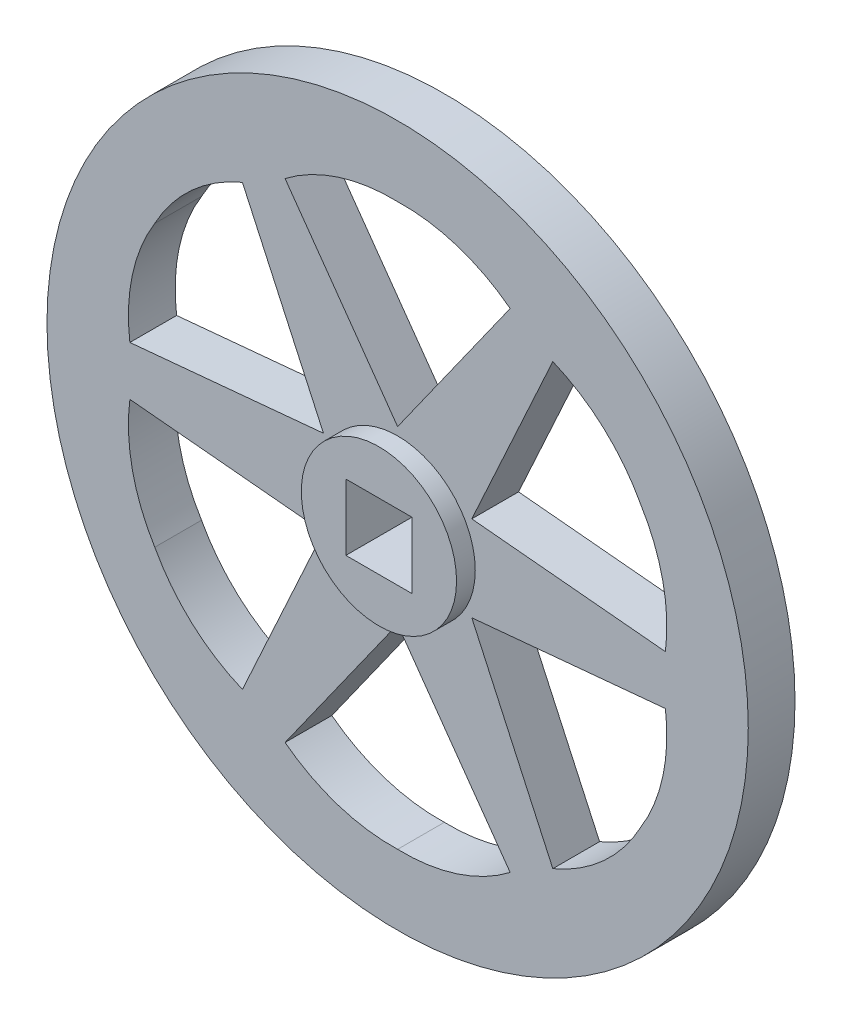
ISO-10303-21;
HEADER;
FILE_DESCRIPTION(('STEP AP214'),'2;1');
FILE_NAME('part.step','',(''),(''),'','','');
FILE_SCHEMA(('AUTOMOTIVE_DESIGN { 1 0 10303 214 1 1 1 1 }'));
ENDSEC;
DATA;
#1=APPLICATION_CONTEXT('core data for automotive mechanical design processes');
#2=APPLICATION_PROTOCOL_DEFINITION('international standard','automotive_design',2000,#1);
#3=PRODUCT_CONTEXT('',#1,'mechanical');
#4=PRODUCT('Part','Part','',(#3));
#5=PRODUCT_RELATED_PRODUCT_CATEGORY('part','',(#4));
#6=PRODUCT_DEFINITION_FORMATION('','',#4);
#7=PRODUCT_DEFINITION_CONTEXT('part definition',#1,'design');
#8=PRODUCT_DEFINITION('design','',#6,#7);
#9=PRODUCT_DEFINITION_SHAPE('','',#8);
#10=(LENGTH_UNIT() NAMED_UNIT(*) SI_UNIT(.MILLI.,.METRE.));
#11=(NAMED_UNIT(*) PLANE_ANGLE_UNIT() SI_UNIT($,.RADIAN.));
#12=(NAMED_UNIT(*) SI_UNIT($,.STERADIAN.) SOLID_ANGLE_UNIT());
#13=UNCERTAINTY_MEASURE_WITH_UNIT(LENGTH_MEASURE(1.E-05),#10,'distance_accuracy_value','');
#14=(GEOMETRIC_REPRESENTATION_CONTEXT(3) GLOBAL_UNCERTAINTY_ASSIGNED_CONTEXT((#13)) GLOBAL_UNIT_ASSIGNED_CONTEXT((#10,
#11,#12)) REPRESENTATION_CONTEXT('',''));
#15=CARTESIAN_POINT('',(0.,0.,0.));
#16=DIRECTION('',(0.,0.,1.));
#17=DIRECTION('',(1.,0.,0.));
#18=AXIS2_PLACEMENT_3D('',#15,#16,#17);
#19=CARTESIAN_POINT('',(0.,0.,2.5));
#20=DIRECTION('',(0.,0.,1.));
#21=DIRECTION('',(1.,0.,0.));
#22=AXIS2_PLACEMENT_3D('',#19,#20,#21);
#23=PLANE('',#22);
#24=CARTESIAN_POINT('',(-0.556753217472661,-11.0764587476202,2.5));
#25=DIRECTION('',(0.,0.,1.));
#26=DIRECTION('',(1.,0.,0.));
#27=AXIS2_PLACEMENT_3D('',#24,#25,#26);
#28=CIRCLE('',#27,18.919878493588);
#29=CARTESIAN_POINT('',(0.,-29.9881437086957,2.5));
#30=VERTEX_POINT('',#29);
#31=CARTESIAN_POINT('',(-12.0370715636614,-26.1152117837697,2.5));
#32=VERTEX_POINT('',#31);
#33=EDGE_CURVE('E358',#30,#32,#28,.F.);
#34=ORIENTED_EDGE('',*,*,#33,.T.);
#35=DIRECTION('',(0.578854986452261,0.815430502654489,0.));
#36=VECTOR('',#35,1.);
#37=CARTESIAN_POINT('',(4.32302539752465,-3.0688143254033,2.5));
#38=LINE('',#37,#36);
#39=CARTESIAN_POINT('',(0.,-9.15864140713367,2.5));
#40=VERTEX_POINT('',#39);
#41=EDGE_CURVE('E361',#32,#40,#38,.T.);
#42=ORIENTED_EDGE('',*,*,#41,.T.);
#43=DIRECTION('',(0.578854986452261,-0.815430502654489,0.));
#44=VECTOR('',#43,1.);
#45=CARTESIAN_POINT('',(-4.32302539752465,-3.0688143254033,2.5));
#46=LINE('',#45,#44);
#47=CARTESIAN_POINT('',(12.0370715636614,-26.1152117837697,2.5));
#48=VERTEX_POINT('',#47);
#49=EDGE_CURVE('E352',#40,#48,#46,.T.);
#50=ORIENTED_EDGE('',*,*,#49,.T.);
#51=CARTESIAN_POINT('',(0.556753217472661,-11.0764587476202,2.5));
#52=DIRECTION('',(0.,0.,1.));
#53=DIRECTION('',(1.,0.,0.));
#54=AXIS2_PLACEMENT_3D('',#51,#52,#53);
#55=CIRCLE('',#54,18.919878493588);
#56=EDGE_CURVE('E355',#48,#30,#55,.F.);
#57=ORIENTED_EDGE('',*,*,#56,.T.);
#58=EDGE_LOOP('',(#34,#42,#50,#57));
#59=FACE_BOUND('',#58,.T.);
#60=CARTESIAN_POINT('',(-9.87087126814579,-5.05606694384011,2.5));
#61=DIRECTION('',(0.,0.,1.));
#62=DIRECTION('',(1.,0.,0.));
#63=AXIS2_PLACEMENT_3D('',#60,#61,#62);
#64=CIRCLE('',#63,18.919878493588);
#65=CARTESIAN_POINT('',(-25.9704942640689,-14.994071854348,2.5));
#66=VERTEX_POINT('',#65);
#67=CARTESIAN_POINT('',(-28.634972611786,-2.63319613058295,2.5));
#68=VERTEX_POINT('',#67);
#69=EDGE_CURVE('E346',#66,#68,#64,.F.);
#70=ORIENTED_EDGE('',*,*,#69,.T.);
#71=DIRECTION('',(0.995611023545633,-0.0935878720477059,0.));
#72=VECTOR('',#71,1.);
#73=CARTESIAN_POINT('',(-0.496158466534514,-5.27825697816332,2.5));
#74=LINE('',#73,#72);
#75=CARTESIAN_POINT('',(-7.9316161227298,-4.57932070356687,2.5));
#76=VERTEX_POINT('',#75);
#77=EDGE_CURVE('E349',#68,#76,#74,.T.);
#78=ORIENTED_EDGE('',*,*,#77,.T.);
#79=DIRECTION('',(-0.416756037093367,-0.909018374702202,0.));
#80=VECTOR('',#79,1.);
#81=CARTESIAN_POINT('',(-4.8191838640592,2.20944265275999,2.5));
#82=LINE('',#81,#80);
#83=CARTESIAN_POINT('',(-16.5979010481245,-23.482015653187,2.5));
#84=VERTEX_POINT('',#83);
#85=EDGE_CURVE('E340',#76,#84,#82,.T.);
#86=ORIENTED_EDGE('',*,*,#85,.T.);
#87=CARTESIAN_POINT('',(-9.31411805067312,-6.0203918037802,2.5));
#88=DIRECTION('',(0.,0.,1.));
#89=DIRECTION('',(1.,0.,0.));
#90=AXIS2_PLACEMENT_3D('',#87,#88,#89);
#91=CIRCLE('',#90,18.919878493588);
#92=EDGE_CURVE('E343',#84,#66,#91,.F.);
#93=ORIENTED_EDGE('',*,*,#92,.T.);
#94=EDGE_LOOP('',(#70,#78,#86,#93));
#95=FACE_BOUND('',#94,.T.);
#96=CARTESIAN_POINT('',(9.3141180506732,-6.02039180378007,2.5));
#97=DIRECTION('',(0.,0.,1.));
#98=DIRECTION('',(1.,0.,0.));
#99=AXIS2_PLACEMENT_3D('',#96,#97,#98);
#100=CIRCLE('',#99,18.919878493588);
#101=CARTESIAN_POINT('',(25.9704942640691,-14.9940718543476,2.5));
#102=VERTEX_POINT('',#101);
#103=CARTESIAN_POINT('',(16.5979010481248,-23.4820156531867,2.5));
#104=VERTEX_POINT('',#103);
#105=EDGE_CURVE('E334',#102,#104,#100,.F.);
#106=ORIENTED_EDGE('',*,*,#105,.T.);
#107=DIRECTION('',(-0.41675603709338,0.909018374702196,0.));
#108=VECTOR('',#107,1.);
#109=CARTESIAN_POINT('',(4.81918386405916,2.20944265276006,2.5));
#110=LINE('',#109,#108);
#111=CARTESIAN_POINT('',(7.93161612272986,-4.57932070356676,2.5));
#112=VERTEX_POINT('',#111);
#113=EDGE_CURVE('E337',#104,#112,#110,.T.);
#114=ORIENTED_EDGE('',*,*,#113,.T.);
#115=DIRECTION('',(0.995611023545631,0.0935878720477197,0.));
#116=VECTOR('',#115,1.);
#117=CARTESIAN_POINT('',(0.496158466534587,-5.27825697816331,2.5));
#118=LINE('',#117,#116);
#119=CARTESIAN_POINT('',(28.634972611786,-2.63319613058255,2.5));
#120=VERTEX_POINT('',#119);
#121=EDGE_CURVE('E328',#112,#120,#118,.T.);
#122=ORIENTED_EDGE('',*,*,#121,.T.);
#123=CARTESIAN_POINT('',(9.87087126814585,-5.05606694383997,2.5));
#124=DIRECTION('',(0.,0.,1.));
#125=DIRECTION('',(1.,0.,0.));
#126=AXIS2_PLACEMENT_3D('',#123,#124,#125);
#127=CIRCLE('',#126,18.919878493588);
#128=EDGE_CURVE('E331',#120,#102,#127,.F.);
#129=ORIENTED_EDGE('',*,*,#128,.T.);
#130=EDGE_LOOP('',(#106,#114,#122,#129));
#131=FACE_BOUND('',#130,.T.);
#132=CARTESIAN_POINT('',(9.87087126814575,5.05606694384018,2.5));
#133=DIRECTION('',(0.,0.,1.));
#134=DIRECTION('',(1.,0.,0.));
#135=AXIS2_PLACEMENT_3D('',#132,#133,#134);
#136=CIRCLE('',#135,18.919878493588);
#137=CARTESIAN_POINT('',(25.9704942640688,14.9940718543481,2.5));
#138=VERTEX_POINT('',#137);
#139=CARTESIAN_POINT('',(28.634972611786,2.63319613058315,2.5));
#140=VERTEX_POINT('',#139);
#141=EDGE_CURVE('E322',#138,#140,#136,.F.);
#142=ORIENTED_EDGE('',*,*,#141,.T.);
#143=DIRECTION('',(-0.995611023545633,0.0935878720476988,0.));
#144=VECTOR('',#143,1.);
#145=CARTESIAN_POINT('',(0.496158466534477,5.27825697816332,2.5));
#146=LINE('',#145,#144);
#147=CARTESIAN_POINT('',(7.93161612272976,4.57932070356693,2.5));
#148=VERTEX_POINT('',#147);
#149=EDGE_CURVE('E325',#140,#148,#146,.T.);
#150=ORIENTED_EDGE('',*,*,#149,.T.);
#151=DIRECTION('',(0.416756037093361,0.909018374702204,0.));
#152=VECTOR('',#151,1.);
#153=CARTESIAN_POINT('',(4.81918386405921,-2.20944265275996,2.5));
#154=LINE('',#153,#152);
#155=CARTESIAN_POINT('',(16.5979010481243,23.4820156531871,2.5));
#156=VERTEX_POINT('',#155);
#157=EDGE_CURVE('E316',#148,#156,#154,.T.);
#158=ORIENTED_EDGE('',*,*,#157,.T.);
#159=CARTESIAN_POINT('',(9.31411805067308,6.02039180378026,2.5));
#160=DIRECTION('',(0.,0.,1.));
#161=DIRECTION('',(1.,0.,0.));
#162=AXIS2_PLACEMENT_3D('',#159,#160,#161);
#163=CIRCLE('',#162,18.919878493588);
#164=EDGE_CURVE('E319',#156,#138,#163,.F.);
#165=ORIENTED_EDGE('',*,*,#164,.T.);
#166=EDGE_LOOP('',(#142,#150,#158,#165));
#167=FACE_BOUND('',#166,.T.);
#168=CARTESIAN_POINT('',(-9.31411805067316,6.02039180378013,2.5));
#169=DIRECTION('',(0.,0.,1.));
#170=DIRECTION('',(1.,0.,0.));
#171=AXIS2_PLACEMENT_3D('',#168,#169,#170);
#172=CIRCLE('',#171,18.919878493588);
#173=CARTESIAN_POINT('',(-25.970494264069,14.9940718543478,2.5));
#174=VERTEX_POINT('',#173);
#175=CARTESIAN_POINT('',(-16.5979010481247,23.4820156531869,2.5));
#176=VERTEX_POINT('',#175);
#177=EDGE_CURVE('E310',#174,#176,#172,.F.);
#178=ORIENTED_EDGE('',*,*,#177,.T.);
#179=DIRECTION('',(0.416756037093373,-0.909018374702199,0.));
#180=VECTOR('',#179,1.);
#181=CARTESIAN_POINT('',(-4.81918386405918,-2.20944265276003,2.5));
#182=LINE('',#181,#180);
#183=CARTESIAN_POINT('',(-7.93161612272983,4.57932070356682,2.5));
#184=VERTEX_POINT('',#183);
#185=EDGE_CURVE('E313',#176,#184,#182,.T.);
#186=ORIENTED_EDGE('',*,*,#185,.T.);
#187=DIRECTION('',(-0.995611023545632,-0.0935878720477127,0.));
#188=VECTOR('',#187,1.);
#189=CARTESIAN_POINT('',(-0.49615846653455,5.27825697816331,2.5));
#190=LINE('',#189,#188);
#191=CARTESIAN_POINT('',(-28.634972611786,2.63319613058275,2.5));
#192=VERTEX_POINT('',#191);
#193=EDGE_CURVE('E304',#184,#192,#190,.T.);
#194=ORIENTED_EDGE('',*,*,#193,.T.);
#195=CARTESIAN_POINT('',(-9.87087126814582,5.05606694384004,2.5));
#196=DIRECTION('',(0.,0.,1.));
#197=DIRECTION('',(1.,0.,0.));
#198=AXIS2_PLACEMENT_3D('',#195,#196,#197);
#199=CIRCLE('',#198,18.919878493588);
#200=EDGE_CURVE('E307',#192,#174,#199,.F.);
#201=ORIENTED_EDGE('',*,*,#200,.T.);
#202=EDGE_LOOP('',(#178,#186,#194,#201));
#203=FACE_BOUND('',#202,.T.);
#204=CARTESIAN_POINT('',(0.556753217472661,11.0764587476202,2.5));
#205=DIRECTION('',(0.,0.,1.));
#206=DIRECTION('',(1.,0.,0.));
#207=AXIS2_PLACEMENT_3D('',#204,#205,#206);
#208=CIRCLE('',#207,18.919878493588);
#209=CARTESIAN_POINT('',(0.,29.9881437086957,2.5));
#210=VERTEX_POINT('',#209);
#211=CARTESIAN_POINT('',(12.0370715636614,26.1152117837697,2.5));
#212=VERTEX_POINT('',#211);
#213=EDGE_CURVE('E381',#210,#212,#208,.F.);
#214=ORIENTED_EDGE('',*,*,#213,.T.);
#215=DIRECTION('',(-0.578854986452261,-0.815430502654489,0.));
#216=VECTOR('',#215,1.);
#217=CARTESIAN_POINT('',(-4.32302539752465,3.0688143254033,2.5));
#218=LINE('',#217,#216);
#219=CARTESIAN_POINT('',(0.,9.15864140713367,2.5));
#220=VERTEX_POINT('',#219);
#221=EDGE_CURVE('E384',#212,#220,#218,.T.);
#222=ORIENTED_EDGE('',*,*,#221,.T.);
#223=DIRECTION('',(-0.578854986452261,0.815430502654489,0.));
#224=VECTOR('',#223,1.);
#225=CARTESIAN_POINT('',(4.32302539752465,3.0688143254033,2.5));
#226=LINE('',#225,#224);
#227=CARTESIAN_POINT('',(-12.0370715636614,26.1152117837697,2.5));
#228=VERTEX_POINT('',#227);
#229=EDGE_CURVE('E375',#220,#228,#226,.T.);
#230=ORIENTED_EDGE('',*,*,#229,.T.);
#231=CARTESIAN_POINT('',(-0.556753217472661,11.0764587476202,2.5));
#232=DIRECTION('',(0.,0.,1.));
#233=DIRECTION('',(1.,0.,0.));
#234=AXIS2_PLACEMENT_3D('',#231,#232,#233);
#235=CIRCLE('',#234,18.919878493588);
#236=EDGE_CURVE('E378',#228,#210,#235,.F.);
#237=ORIENTED_EDGE('',*,*,#236,.T.);
#238=EDGE_LOOP('',(#214,#222,#230,#237));
#239=FACE_BOUND('',#238,.T.);
#240=CARTESIAN_POINT('',(0.,0.,2.5));
#241=DIRECTION('',(0.,0.,1.));
#242=DIRECTION('',(1.,0.,0.));
#243=AXIS2_PLACEMENT_3D('',#240,#241,#242);
#244=CIRCLE('',#243,37.5);
#245=CARTESIAN_POINT('',(37.5,0.,2.5));
#246=VERTEX_POINT('',#245);
#247=EDGE_CURVE('E400',#246,#246,#244,.T.);
#248=ORIENTED_EDGE('',*,*,#247,.T.);
#249=EDGE_LOOP('',(#248));
#250=FACE_BOUND('',#249,.T.);
#251=CARTESIAN_POINT('',(0.,0.,2.5));
#252=DIRECTION('',(0.,0.,1.));
#253=DIRECTION('',(1.,0.,0.));
#254=AXIS2_PLACEMENT_3D('',#251,#252,#253);
#255=CIRCLE('',#254,8.30266201776204);
#256=CARTESIAN_POINT('',(8.30266201776204,0.,2.5));
#257=VERTEX_POINT('',#256);
#258=EDGE_CURVE('E247',#257,#257,#255,.T.);
#259=ORIENTED_EDGE('',*,*,#258,.F.);
#260=EDGE_LOOP('',(#259));
#261=FACE_BOUND('',#260,.T.);
#262=ADVANCED_FACE('F32',(#59,#95,#131,#167,#203,#239,#250,#261),#23,.T.);
#263=CARTESIAN_POINT('',(0.,0.,-2.5));
#264=DIRECTION('',(0.,0.,1.));
#265=DIRECTION('',(1.,0.,0.));
#266=AXIS2_PLACEMENT_3D('',#263,#264,#265);
#267=PLANE('',#266);
#268=DIRECTION('',(0.995611023545633,-0.0935878720477059,0.));
#269=VECTOR('',#268,1.);
#270=CARTESIAN_POINT('',(-0.496158466534514,-5.27825697816332,-2.5));
#271=LINE('',#270,#269);
#272=CARTESIAN_POINT('',(-28.634972611786,-2.63319613058295,-2.5));
#273=VERTEX_POINT('',#272);
#274=CARTESIAN_POINT('',(-7.9316161227298,-4.57932070356687,-2.5));
#275=VERTEX_POINT('',#274);
#276=EDGE_CURVE('E447',#273,#275,#271,.T.);
#277=ORIENTED_EDGE('',*,*,#276,.F.);
#278=CARTESIAN_POINT('',(-9.87087126814579,-5.05606694384011,-2.5));
#279=DIRECTION('',(0.,0.,1.));
#280=DIRECTION('',(1.,0.,0.));
#281=AXIS2_PLACEMENT_3D('',#278,#279,#280);
#282=CIRCLE('',#281,18.919878493588);
#283=CARTESIAN_POINT('',(-25.9704942640689,-14.994071854348,-2.5));
#284=VERTEX_POINT('',#283);
#285=EDGE_CURVE('E445',#284,#273,#282,.F.);
#286=ORIENTED_EDGE('',*,*,#285,.F.);
#287=CARTESIAN_POINT('',(-9.31411805067312,-6.0203918037802,-2.5));
#288=DIRECTION('',(0.,0.,1.));
#289=DIRECTION('',(1.,0.,0.));
#290=AXIS2_PLACEMENT_3D('',#287,#288,#289);
#291=CIRCLE('',#290,18.919878493588);
#292=CARTESIAN_POINT('',(-16.5979010481245,-23.482015653187,-2.5));
#293=VERTEX_POINT('',#292);
#294=EDGE_CURVE('E443',#293,#284,#291,.F.);
#295=ORIENTED_EDGE('',*,*,#294,.F.);
#296=DIRECTION('',(-0.416756037093367,-0.909018374702202,0.));
#297=VECTOR('',#296,1.);
#298=CARTESIAN_POINT('',(-4.8191838640592,2.20944265275999,-2.5));
#299=LINE('',#298,#297);
#300=EDGE_CURVE('E441',#275,#293,#299,.T.);
#301=ORIENTED_EDGE('',*,*,#300,.F.);
#302=EDGE_LOOP('',(#277,#286,#295,#301));
#303=FACE_BOUND('',#302,.T.);
#304=DIRECTION('',(-0.995611023545633,0.0935878720476988,0.));
#305=VECTOR('',#304,1.);
#306=CARTESIAN_POINT('',(0.496158466534477,5.27825697816332,-2.5));
#307=LINE('',#306,#305);
#308=CARTESIAN_POINT('',(28.634972611786,2.63319613058315,-2.5));
#309=VERTEX_POINT('',#308);
#310=CARTESIAN_POINT('',(7.93161612272976,4.57932070356693,-2.5));
#311=VERTEX_POINT('',#310);
#312=EDGE_CURVE('E429',#309,#311,#307,.T.);
#313=ORIENTED_EDGE('',*,*,#312,.F.);
#314=CARTESIAN_POINT('',(9.87087126814575,5.05606694384018,-2.5));
#315=DIRECTION('',(0.,0.,1.));
#316=DIRECTION('',(1.,0.,0.));
#317=AXIS2_PLACEMENT_3D('',#314,#315,#316);
#318=CIRCLE('',#317,18.919878493588);
#319=CARTESIAN_POINT('',(25.9704942640688,14.9940718543481,-2.5));
#320=VERTEX_POINT('',#319);
#321=EDGE_CURVE('E427',#320,#309,#318,.F.);
#322=ORIENTED_EDGE('',*,*,#321,.F.);
#323=CARTESIAN_POINT('',(9.31411805067308,6.02039180378026,-2.5));
#324=DIRECTION('',(0.,0.,1.));
#325=DIRECTION('',(1.,0.,0.));
#326=AXIS2_PLACEMENT_3D('',#323,#324,#325);
#327=CIRCLE('',#326,18.919878493588);
#328=CARTESIAN_POINT('',(16.5979010481243,23.4820156531871,-2.5));
#329=VERTEX_POINT('',#328);
#330=EDGE_CURVE('E425',#329,#320,#327,.F.);
#331=ORIENTED_EDGE('',*,*,#330,.F.);
#332=DIRECTION('',(0.416756037093361,0.909018374702204,0.));
#333=VECTOR('',#332,1.);
#334=CARTESIAN_POINT('',(4.81918386405921,-2.20944265275996,-2.5));
#335=LINE('',#334,#333);
#336=EDGE_CURVE('E423',#311,#329,#335,.T.);
#337=ORIENTED_EDGE('',*,*,#336,.F.);
#338=EDGE_LOOP('',(#313,#322,#331,#337));
#339=FACE_BOUND('',#338,.T.);
#340=DIRECTION('',(-0.578854986452261,-0.815430502654489,0.));
#341=VECTOR('',#340,1.);
#342=CARTESIAN_POINT('',(-4.32302539752465,3.0688143254033,-2.5));
#343=LINE('',#342,#341);
#344=CARTESIAN_POINT('',(12.0370715636614,26.1152117837697,-2.5));
#345=VERTEX_POINT('',#344);
#346=CARTESIAN_POINT('',(0.,9.15864140713367,-2.5));
#347=VERTEX_POINT('',#346);
#348=EDGE_CURVE('E411',#345,#347,#343,.T.);
#349=ORIENTED_EDGE('',*,*,#348,.F.);
#350=CARTESIAN_POINT('',(0.556753217472661,11.0764587476202,-2.5));
#351=DIRECTION('',(0.,0.,1.));
#352=DIRECTION('',(1.,0.,0.));
#353=AXIS2_PLACEMENT_3D('',#350,#351,#352);
#354=CIRCLE('',#353,18.919878493588);
#355=CARTESIAN_POINT('',(0.,29.9881437086957,-2.5));
#356=VERTEX_POINT('',#355);
#357=EDGE_CURVE('E409',#356,#345,#354,.F.);
#358=ORIENTED_EDGE('',*,*,#357,.F.);
#359=CARTESIAN_POINT('',(-0.556753217472661,11.0764587476202,-2.5));
#360=DIRECTION('',(0.,0.,1.));
#361=DIRECTION('',(1.,0.,0.));
#362=AXIS2_PLACEMENT_3D('',#359,#360,#361);
#363=CIRCLE('',#362,18.919878493588);
#364=CARTESIAN_POINT('',(-12.0370715636614,26.1152117837697,-2.5));
#365=VERTEX_POINT('',#364);
#366=EDGE_CURVE('E407',#365,#356,#363,.F.);
#367=ORIENTED_EDGE('',*,*,#366,.F.);
#368=DIRECTION('',(-0.578854986452261,0.815430502654489,0.));
#369=VECTOR('',#368,1.);
#370=CARTESIAN_POINT('',(4.32302539752465,3.0688143254033,-2.5));
#371=LINE('',#370,#369);
#372=EDGE_CURVE('E403',#347,#365,#371,.T.);
#373=ORIENTED_EDGE('',*,*,#372,.F.);
#374=EDGE_LOOP('',(#349,#358,#367,#373));
#375=FACE_BOUND('',#374,.T.);
#376=CARTESIAN_POINT('',(0.,0.,-2.5));
#377=DIRECTION('',(0.,0.,1.));
#378=DIRECTION('',(1.,0.,0.));
#379=AXIS2_PLACEMENT_3D('',#376,#377,#378);
#380=CIRCLE('',#379,37.5);
#381=CARTESIAN_POINT('',(37.5,0.,-2.5));
#382=VERTEX_POINT('',#381);
#383=EDGE_CURVE('E227',#382,#382,#380,.T.);
#384=ORIENTED_EDGE('',*,*,#383,.F.);
#385=EDGE_LOOP('',(#384));
#386=FACE_BOUND('',#385,.T.);
#387=DIRECTION('',(0.,-1.,0.));
#388=VECTOR('',#387,1.);
#389=CARTESIAN_POINT('',(-3.53553390593274,-3.53553390593274,-2.5));
#390=LINE('',#389,#388);
#391=CARTESIAN_POINT('',(-3.53553390593274,3.53553390593274,-2.5));
#392=VERTEX_POINT('',#391);
#393=CARTESIAN_POINT('',(-3.53553390593274,-3.53553390593274,-2.5));
#394=VERTEX_POINT('',#393);
#395=EDGE_CURVE('E387',#392,#394,#390,.T.);
#396=ORIENTED_EDGE('',*,*,#395,.T.);
#397=DIRECTION('',(1.,0.,0.));
#398=VECTOR('',#397,1.);
#399=CARTESIAN_POINT('',(3.53553390593274,-3.53553390593274,-2.5));
#400=LINE('',#399,#398);
#401=CARTESIAN_POINT('',(3.53553390593274,-3.53553390593274,-2.5));
#402=VERTEX_POINT('',#401);
#403=EDGE_CURVE('E224',#394,#402,#400,.T.);
#404=ORIENTED_EDGE('',*,*,#403,.T.);
#405=DIRECTION('',(0.,1.,0.));
#406=VECTOR('',#405,1.);
#407=CARTESIAN_POINT('',(3.53553390593274,-3.53553390593274,-2.5));
#408=LINE('',#407,#406);
#409=CARTESIAN_POINT('',(3.53553390593274,3.53553390593274,-2.5));
#410=VERTEX_POINT('',#409);
#411=EDGE_CURVE('E390',#402,#410,#408,.T.);
#412=ORIENTED_EDGE('',*,*,#411,.T.);
#413=DIRECTION('',(-1.,0.,0.));
#414=VECTOR('',#413,1.);
#415=CARTESIAN_POINT('',(3.53553390593274,3.53553390593274,-2.5));
#416=LINE('',#415,#414);
#417=EDGE_CURVE('E393',#410,#392,#416,.T.);
#418=ORIENTED_EDGE('',*,*,#417,.T.);
#419=EDGE_LOOP('',(#396,#404,#412,#418));
#420=FACE_BOUND('',#419,.T.);
#421=DIRECTION('',(0.416756037093373,-0.909018374702199,0.));
#422=VECTOR('',#421,1.);
#423=CARTESIAN_POINT('',(-4.81918386405918,-2.20944265276003,-2.5));
#424=LINE('',#423,#422);
#425=CARTESIAN_POINT('',(-16.5979010481247,23.4820156531869,-2.5));
#426=VERTEX_POINT('',#425);
#427=CARTESIAN_POINT('',(-7.93161612272983,4.57932070356682,-2.5));
#428=VERTEX_POINT('',#427);
#429=EDGE_CURVE('E420',#426,#428,#424,.T.);
#430=ORIENTED_EDGE('',*,*,#429,.F.);
#431=CARTESIAN_POINT('',(-9.31411805067316,6.02039180378013,-2.5));
#432=DIRECTION('',(0.,0.,1.));
#433=DIRECTION('',(1.,0.,0.));
#434=AXIS2_PLACEMENT_3D('',#431,#432,#433);
#435=CIRCLE('',#434,18.919878493588);
#436=CARTESIAN_POINT('',(-25.970494264069,14.9940718543478,-2.5));
#437=VERTEX_POINT('',#436);
#438=EDGE_CURVE('E418',#437,#426,#435,.F.);
#439=ORIENTED_EDGE('',*,*,#438,.F.);
#440=CARTESIAN_POINT('',(-9.87087126814582,5.05606694384004,-2.5));
#441=DIRECTION('',(0.,0.,1.));
#442=DIRECTION('',(1.,0.,0.));
#443=AXIS2_PLACEMENT_3D('',#440,#441,#442);
#444=CIRCLE('',#443,18.919878493588);
#445=CARTESIAN_POINT('',(-28.634972611786,2.63319613058275,-2.5));
#446=VERTEX_POINT('',#445);
#447=EDGE_CURVE('E416',#446,#437,#444,.F.);
#448=ORIENTED_EDGE('',*,*,#447,.F.);
#449=DIRECTION('',(-0.995611023545632,-0.0935878720477127,0.));
#450=VECTOR('',#449,1.);
#451=CARTESIAN_POINT('',(-0.49615846653455,5.27825697816331,-2.5));
#452=LINE('',#451,#450);
#453=EDGE_CURVE('E414',#428,#446,#452,.T.);
#454=ORIENTED_EDGE('',*,*,#453,.F.);
#455=EDGE_LOOP('',(#430,#439,#448,#454));
#456=FACE_BOUND('',#455,.T.);
#457=DIRECTION('',(-0.41675603709338,0.909018374702196,0.));
#458=VECTOR('',#457,1.);
#459=CARTESIAN_POINT('',(4.81918386405916,2.20944265276006,-2.5));
#460=LINE('',#459,#458);
#461=CARTESIAN_POINT('',(16.5979010481248,-23.4820156531867,-2.5));
#462=VERTEX_POINT('',#461);
#463=CARTESIAN_POINT('',(7.93161612272986,-4.57932070356676,-2.5));
#464=VERTEX_POINT('',#463);
#465=EDGE_CURVE('E438',#462,#464,#460,.T.);
#466=ORIENTED_EDGE('',*,*,#465,.F.);
#467=CARTESIAN_POINT('',(9.3141180506732,-6.02039180378007,-2.5));
#468=DIRECTION('',(0.,0.,1.));
#469=DIRECTION('',(1.,0.,0.));
#470=AXIS2_PLACEMENT_3D('',#467,#468,#469);
#471=CIRCLE('',#470,18.919878493588);
#472=CARTESIAN_POINT('',(25.9704942640691,-14.9940718543476,-2.5));
#473=VERTEX_POINT('',#472);
#474=EDGE_CURVE('E436',#473,#462,#471,.F.);
#475=ORIENTED_EDGE('',*,*,#474,.F.);
#476=CARTESIAN_POINT('',(9.87087126814585,-5.05606694383997,-2.5));
#477=DIRECTION('',(0.,0.,1.));
#478=DIRECTION('',(1.,0.,0.));
#479=AXIS2_PLACEMENT_3D('',#476,#477,#478);
#480=CIRCLE('',#479,18.919878493588);
#481=CARTESIAN_POINT('',(28.634972611786,-2.63319613058255,-2.5));
#482=VERTEX_POINT('',#481);
#483=EDGE_CURVE('E434',#482,#473,#480,.F.);
#484=ORIENTED_EDGE('',*,*,#483,.F.);
#485=DIRECTION('',(0.995611023545631,0.0935878720477197,0.));
#486=VECTOR('',#485,1.);
#487=CARTESIAN_POINT('',(0.496158466534587,-5.27825697816331,-2.5));
#488=LINE('',#487,#486);
#489=EDGE_CURVE('E432',#464,#482,#488,.T.);
#490=ORIENTED_EDGE('',*,*,#489,.F.);
#491=EDGE_LOOP('',(#466,#475,#484,#490));
#492=FACE_BOUND('',#491,.T.);
#493=DIRECTION('',(0.578854986452261,0.815430502654489,0.));
#494=VECTOR('',#493,1.);
#495=CARTESIAN_POINT('',(4.32302539752465,-3.0688143254033,-2.5));
#496=LINE('',#495,#494);
#497=CARTESIAN_POINT('',(-12.0370715636614,-26.1152117837697,-2.5));
#498=VERTEX_POINT('',#497);
#499=CARTESIAN_POINT('',(0.,-9.15864140713367,-2.5));
#500=VERTEX_POINT('',#499);
#501=EDGE_CURVE('E11',#498,#500,#496,.T.);
#502=ORIENTED_EDGE('',*,*,#501,.F.);
#503=CARTESIAN_POINT('',(-0.556753217472661,-11.0764587476202,-2.5));
#504=DIRECTION('',(0.,0.,1.));
#505=DIRECTION('',(1.,0.,0.));
#506=AXIS2_PLACEMENT_3D('',#503,#504,#505);
#507=CIRCLE('',#506,18.919878493588);
#508=CARTESIAN_POINT('',(0.,-29.9881437086957,-2.5));
#509=VERTEX_POINT('',#508);
#510=EDGE_CURVE('E40',#509,#498,#507,.F.);
#511=ORIENTED_EDGE('',*,*,#510,.F.);
#512=CARTESIAN_POINT('',(0.556753217472661,-11.0764587476202,-2.5));
#513=DIRECTION('',(0.,0.,1.));
#514=DIRECTION('',(1.,0.,0.));
#515=AXIS2_PLACEMENT_3D('',#512,#513,#514);
#516=CIRCLE('',#515,18.919878493588);
#517=CARTESIAN_POINT('',(12.0370715636614,-26.1152117837697,-2.5));
#518=VERTEX_POINT('',#517);
#519=EDGE_CURVE('E452',#518,#509,#516,.F.);
#520=ORIENTED_EDGE('',*,*,#519,.F.);
#521=DIRECTION('',(0.578854986452261,-0.815430502654489,0.));
#522=VECTOR('',#521,1.);
#523=CARTESIAN_POINT('',(-4.32302539752465,-3.0688143254033,-2.5));
#524=LINE('',#523,#522);
#525=EDGE_CURVE('E450',#500,#518,#524,.T.);
#526=ORIENTED_EDGE('',*,*,#525,.F.);
#527=EDGE_LOOP('',(#502,#511,#520,#526));
#528=FACE_BOUND('',#527,.T.);
#529=ADVANCED_FACE('F465',(#303,#339,#375,#386,#420,#456,#492,#528),#267,.F.);
#530=CARTESIAN_POINT('',(0.,0.,2.5));
#531=DIRECTION('',(0.,0.,-1.));
#532=DIRECTION('',(-1.,0.,0.));
#533=AXIS2_PLACEMENT_3D('',#530,#531,#532);
#534=CYLINDRICAL_SURFACE('',#533,37.5);
#535=ORIENTED_EDGE('',*,*,#247,.F.);
#536=EDGE_LOOP('',(#535));
#537=FACE_BOUND('',#536,.T.);
#538=ORIENTED_EDGE('',*,*,#383,.T.);
#539=EDGE_LOOP('',(#538));
#540=FACE_BOUND('',#539,.T.);
#541=ADVANCED_FACE('F34',(#537,#540),#534,.T.);
#542=CARTESIAN_POINT('',(-3.53553390593274,-3.53553390593274,2.5));
#543=DIRECTION('',(1.,0.,0.));
#544=DIRECTION('',(0.,0.,-1.));
#545=AXIS2_PLACEMENT_3D('',#542,#543,#544);
#546=PLANE('',#545);
#547=ORIENTED_EDGE('',*,*,#395,.F.);
#548=DIRECTION('',(0.,0.,-1.));
#549=VECTOR('',#548,1.);
#550=CARTESIAN_POINT('',(-3.53553390593274,3.53553390593274,2.5));
#551=LINE('',#550,#549);
#552=CARTESIAN_POINT('',(-3.53553390593274,3.53553390593274,4.5));
#553=VERTEX_POINT('',#552);
#554=EDGE_CURVE('E234',#553,#392,#551,.T.);
#555=ORIENTED_EDGE('',*,*,#554,.F.);
#556=DIRECTION('',(0.,-1.,0.));
#557=VECTOR('',#556,1.);
#558=CARTESIAN_POINT('',(-3.53553390593274,-3.53553390593274,4.5));
#559=LINE('',#558,#557);
#560=CARTESIAN_POINT('',(-3.53553390593274,-3.53553390593274,4.5));
#561=VERTEX_POINT('',#560);
#562=EDGE_CURVE('E231',#553,#561,#559,.T.);
#563=ORIENTED_EDGE('',*,*,#562,.T.);
#564=DIRECTION('',(0.,0.,-1.));
#565=VECTOR('',#564,1.);
#566=CARTESIAN_POINT('',(-3.53553390593274,-3.53553390593274,2.5));
#567=LINE('',#566,#565);
#568=EDGE_CURVE('E217',#561,#394,#567,.T.);
#569=ORIENTED_EDGE('',*,*,#568,.T.);
#570=EDGE_LOOP('',(#547,#555,#563,#569));
#571=FACE_BOUND('',#570,.T.);
#572=ADVANCED_FACE('F232',(#571),#546,.T.);
#573=CARTESIAN_POINT('',(3.53553390593274,-3.53553390593274,2.5));
#574=DIRECTION('',(0.,1.,0.));
#575=DIRECTION('',(-1.,0.,0.));
#576=AXIS2_PLACEMENT_3D('',#573,#574,#575);
#577=PLANE('',#576);
#578=ORIENTED_EDGE('',*,*,#403,.F.);
#579=ORIENTED_EDGE('',*,*,#568,.F.);
#580=DIRECTION('',(1.,0.,0.));
#581=VECTOR('',#580,1.);
#582=CARTESIAN_POINT('',(3.53553390593274,-3.53553390593274,4.5));
#583=LINE('',#582,#581);
#584=CARTESIAN_POINT('',(3.53553390593274,-3.53553390593274,4.5));
#585=VERTEX_POINT('',#584);
#586=EDGE_CURVE('E221',#561,#585,#583,.T.);
#587=ORIENTED_EDGE('',*,*,#586,.T.);
#588=DIRECTION('',(0.,0.,-1.));
#589=VECTOR('',#588,1.);
#590=CARTESIAN_POINT('',(3.53553390593274,-3.53553390593274,2.5));
#591=LINE('',#590,#589);
#592=EDGE_CURVE('E228',#585,#402,#591,.T.);
#593=ORIENTED_EDGE('',*,*,#592,.T.);
#594=EDGE_LOOP('',(#578,#579,#587,#593));
#595=FACE_BOUND('',#594,.T.);
#596=ADVANCED_FACE('F219',(#595),#577,.T.);
#597=CARTESIAN_POINT('',(3.53553390593274,-3.53553390593274,2.5));
#598=DIRECTION('',(-1.,0.,0.));
#599=DIRECTION('',(0.,-1.,0.));
#600=AXIS2_PLACEMENT_3D('',#597,#598,#599);
#601=PLANE('',#600);
#602=ORIENTED_EDGE('',*,*,#411,.F.);
#603=ORIENTED_EDGE('',*,*,#592,.F.);
#604=DIRECTION('',(0.,1.,0.));
#605=VECTOR('',#604,1.);
#606=CARTESIAN_POINT('',(3.53553390593274,-3.53553390593274,4.5));
#607=LINE('',#606,#605);
#608=CARTESIAN_POINT('',(3.53553390593274,3.53553390593274,4.5));
#609=VERTEX_POINT('',#608);
#610=EDGE_CURVE('E241',#585,#609,#607,.T.);
#611=ORIENTED_EDGE('',*,*,#610,.T.);
#612=DIRECTION('',(0.,0.,-1.));
#613=VECTOR('',#612,1.);
#614=CARTESIAN_POINT('',(3.53553390593274,3.53553390593274,2.5));
#615=LINE('',#614,#613);
#616=EDGE_CURVE('E397',#609,#410,#615,.T.);
#617=ORIENTED_EDGE('',*,*,#616,.T.);
#618=EDGE_LOOP('',(#602,#603,#611,#617));
#619=FACE_BOUND('',#618,.T.);
#620=ADVANCED_FACE('F583',(#619),#601,.T.);
#621=CARTESIAN_POINT('',(3.53553390593274,3.53553390593274,2.5));
#622=DIRECTION('',(0.,-1.,0.));
#623=DIRECTION('',(1.,0.,0.));
#624=AXIS2_PLACEMENT_3D('',#621,#622,#623);
#625=PLANE('',#624);
#626=ORIENTED_EDGE('',*,*,#417,.F.);
#627=ORIENTED_EDGE('',*,*,#616,.F.);
#628=DIRECTION('',(-1.,0.,0.));
#629=VECTOR('',#628,1.);
#630=CARTESIAN_POINT('',(3.53553390593274,3.53553390593274,4.5));
#631=LINE('',#630,#629);
#632=EDGE_CURVE('E243',#609,#553,#631,.T.);
#633=ORIENTED_EDGE('',*,*,#632,.T.);
#634=ORIENTED_EDGE('',*,*,#554,.T.);
#635=EDGE_LOOP('',(#626,#627,#633,#634));
#636=FACE_BOUND('',#635,.T.);
#637=ADVANCED_FACE('F579',(#636),#625,.T.);
#638=CARTESIAN_POINT('',(0.,9.15864140713367,4.));
#639=DIRECTION('',(-0.815430502654489,0.578854986452261,0.));
#640=DIRECTION('',(-0.578854986452261,-0.815430502654489,0.));
#641=AXIS2_PLACEMENT_3D('',#638,#639,#640);
#642=PLANE('',#641);
#643=DIRECTION('',(0.,0.,-1.));
#644=VECTOR('',#643,1.);
#645=CARTESIAN_POINT('',(12.0370715636614,26.1152117837697,4.));
#646=LINE('',#645,#644);
#647=EDGE_CURVE('E372',#212,#345,#646,.T.);
#648=ORIENTED_EDGE('',*,*,#647,.T.);
#649=ORIENTED_EDGE('',*,*,#348,.T.);
#650=DIRECTION('',(0.,0.,-1.));
#651=VECTOR('',#650,1.);
#652=CARTESIAN_POINT('',(0.,9.15864140713367,4.));
#653=LINE('',#652,#651);
#654=EDGE_CURVE('E364',#220,#347,#653,.T.);
#655=ORIENTED_EDGE('',*,*,#654,.F.);
#656=ORIENTED_EDGE('',*,*,#221,.F.);
#657=EDGE_LOOP('',(#648,#649,#655,#656));
#658=FACE_BOUND('',#657,.T.);
#659=ADVANCED_FACE('F575',(#658),#642,.T.);
#660=CARTESIAN_POINT('',(0.556753217472661,11.0764587476202,4.));
#661=DIRECTION('',(0.,0.,-1.));
#662=DIRECTION('',(-1.,0.,0.));
#663=AXIS2_PLACEMENT_3D('',#660,#661,#662);
#664=CYLINDRICAL_SURFACE('',#663,18.919878493588);
#665=DIRECTION('',(0.,0.,-1.));
#666=VECTOR('',#665,1.);
#667=CARTESIAN_POINT('',(0.,29.9881437086957,4.));
#668=LINE('',#667,#666);
#669=EDGE_CURVE('E369',#210,#356,#668,.T.);
#670=ORIENTED_EDGE('',*,*,#669,.T.);
#671=ORIENTED_EDGE('',*,*,#357,.T.);
#672=ORIENTED_EDGE('',*,*,#647,.F.);
#673=ORIENTED_EDGE('',*,*,#213,.F.);
#674=EDGE_LOOP('',(#670,#671,#672,#673));
#675=FACE_BOUND('',#674,.T.);
#676=ADVANCED_FACE('F571',(#675),#664,.F.);
#677=CARTESIAN_POINT('',(-0.556753217472661,11.0764587476202,4.));
#678=DIRECTION('',(0.,0.,-1.));
#679=DIRECTION('',(-1.,0.,0.));
#680=AXIS2_PLACEMENT_3D('',#677,#678,#679);
#681=CYLINDRICAL_SURFACE('',#680,18.919878493588);
#682=DIRECTION('',(0.,0.,-1.));
#683=VECTOR('',#682,1.);
#684=CARTESIAN_POINT('',(-12.0370715636614,26.1152117837697,4.));
#685=LINE('',#684,#683);
#686=EDGE_CURVE('E366',#228,#365,#685,.T.);
#687=ORIENTED_EDGE('',*,*,#686,.T.);
#688=ORIENTED_EDGE('',*,*,#366,.T.);
#689=ORIENTED_EDGE('',*,*,#669,.F.);
#690=ORIENTED_EDGE('',*,*,#236,.F.);
#691=EDGE_LOOP('',(#687,#688,#689,#690));
#692=FACE_BOUND('',#691,.T.);
#693=ADVANCED_FACE('F567',(#692),#681,.F.);
#694=CARTESIAN_POINT('',(0.,9.15864140713367,4.));
#695=DIRECTION('',(0.815430502654489,0.578854986452261,0.));
#696=DIRECTION('',(-0.578854986452261,0.815430502654489,0.));
#697=AXIS2_PLACEMENT_3D('',#694,#695,#696);
#698=PLANE('',#697);
#699=ORIENTED_EDGE('',*,*,#654,.T.);
#700=ORIENTED_EDGE('',*,*,#372,.T.);
#701=ORIENTED_EDGE('',*,*,#686,.F.);
#702=ORIENTED_EDGE('',*,*,#229,.F.);
#703=EDGE_LOOP('',(#699,#700,#701,#702));
#704=FACE_BOUND('',#703,.T.);
#705=ADVANCED_FACE('F563',(#704),#698,.T.);
#706=CARTESIAN_POINT('',(-7.93161612272983,4.57932070356682,4.));
#707=DIRECTION('',(-0.909018374702199,-0.416756037093373,0.));
#708=DIRECTION('',(0.416756037093373,-0.909018374702199,0.));
#709=AXIS2_PLACEMENT_3D('',#706,#707,#708);
#710=PLANE('',#709);
#711=DIRECTION('',(0.,0.,-1.));
#712=VECTOR('',#711,1.);
#713=CARTESIAN_POINT('',(-16.5979010481247,23.4820156531869,4.));
#714=LINE('',#713,#712);
#715=EDGE_CURVE('E301',#176,#426,#714,.T.);
#716=ORIENTED_EDGE('',*,*,#715,.T.);
#717=ORIENTED_EDGE('',*,*,#429,.T.);
#718=DIRECTION('',(0.,0.,-1.));
#719=VECTOR('',#718,1.);
#720=CARTESIAN_POINT('',(-7.93161612272983,4.57932070356682,4.));
#721=LINE('',#720,#719);
#722=EDGE_CURVE('E293',#184,#428,#721,.T.);
#723=ORIENTED_EDGE('',*,*,#722,.F.);
#724=ORIENTED_EDGE('',*,*,#185,.F.);
#725=EDGE_LOOP('',(#716,#717,#723,#724));
#726=FACE_BOUND('',#725,.T.);
#727=ADVANCED_FACE('F559',(#726),#710,.T.);
#728=CARTESIAN_POINT('',(-9.31411805067316,6.02039180378013,4.));
#729=DIRECTION('',(0.,0.,-1.));
#730=DIRECTION('',(-1.,0.,0.));
#731=AXIS2_PLACEMENT_3D('',#728,#729,#730);
#732=CYLINDRICAL_SURFACE('',#731,18.919878493588);
#733=DIRECTION('',(0.,0.,-1.));
#734=VECTOR('',#733,1.);
#735=CARTESIAN_POINT('',(-25.970494264069,14.9940718543478,4.));
#736=LINE('',#735,#734);
#737=EDGE_CURVE('E298',#174,#437,#736,.T.);
#738=ORIENTED_EDGE('',*,*,#737,.T.);
#739=ORIENTED_EDGE('',*,*,#438,.T.);
#740=ORIENTED_EDGE('',*,*,#715,.F.);
#741=ORIENTED_EDGE('',*,*,#177,.F.);
#742=EDGE_LOOP('',(#738,#739,#740,#741));
#743=FACE_BOUND('',#742,.T.);
#744=ADVANCED_FACE('F555',(#743),#732,.F.);
#745=CARTESIAN_POINT('',(-9.87087126814582,5.05606694384004,4.));
#746=DIRECTION('',(0.,0.,-1.));
#747=DIRECTION('',(-1.,0.,0.));
#748=AXIS2_PLACEMENT_3D('',#745,#746,#747);
#749=CYLINDRICAL_SURFACE('',#748,18.919878493588);
#750=DIRECTION('',(0.,0.,-1.));
#751=VECTOR('',#750,1.);
#752=CARTESIAN_POINT('',(-28.634972611786,2.63319613058275,4.));
#753=LINE('',#752,#751);
#754=EDGE_CURVE('E295',#192,#446,#753,.T.);
#755=ORIENTED_EDGE('',*,*,#754,.T.);
#756=ORIENTED_EDGE('',*,*,#447,.T.);
#757=ORIENTED_EDGE('',*,*,#737,.F.);
#758=ORIENTED_EDGE('',*,*,#200,.F.);
#759=EDGE_LOOP('',(#755,#756,#757,#758));
#760=FACE_BOUND('',#759,.T.);
#761=ADVANCED_FACE('F551',(#760),#749,.F.);
#762=CARTESIAN_POINT('',(-7.93161612272983,4.57932070356682,4.));
#763=DIRECTION('',(-0.0935878720477127,0.995611023545632,0.));
#764=DIRECTION('',(-0.995611023545632,-0.0935878720477127,0.));
#765=AXIS2_PLACEMENT_3D('',#762,#763,#764);
#766=PLANE('',#765);
#767=ORIENTED_EDGE('',*,*,#722,.T.);
#768=ORIENTED_EDGE('',*,*,#453,.T.);
#769=ORIENTED_EDGE('',*,*,#754,.F.);
#770=ORIENTED_EDGE('',*,*,#193,.F.);
#771=EDGE_LOOP('',(#767,#768,#769,#770));
#772=FACE_BOUND('',#771,.T.);
#773=ADVANCED_FACE('F525',(#772),#766,.T.);
#774=CARTESIAN_POINT('',(7.93161612272976,4.57932070356693,4.));
#775=DIRECTION('',(0.0935878720476988,0.995611023545633,0.));
#776=DIRECTION('',(-0.995611023545633,0.0935878720476988,0.));
#777=AXIS2_PLACEMENT_3D('',#774,#775,#776);
#778=PLANE('',#777);
#779=DIRECTION('',(0.,0.,-1.));
#780=VECTOR('',#779,1.);
#781=CARTESIAN_POINT('',(28.634972611786,2.63319613058315,4.));
#782=LINE('',#781,#780);
#783=EDGE_CURVE('E257',#140,#309,#782,.T.);
#784=ORIENTED_EDGE('',*,*,#783,.T.);
#785=ORIENTED_EDGE('',*,*,#312,.T.);
#786=DIRECTION('',(0.,0.,-1.));
#787=VECTOR('',#786,1.);
#788=CARTESIAN_POINT('',(7.93161612272976,4.57932070356693,4.));
#789=LINE('',#788,#787);
#790=EDGE_CURVE('E251',#148,#311,#789,.T.);
#791=ORIENTED_EDGE('',*,*,#790,.F.);
#792=ORIENTED_EDGE('',*,*,#149,.F.);
#793=EDGE_LOOP('',(#784,#785,#791,#792));
#794=FACE_BOUND('',#793,.T.);
#795=ADVANCED_FACE('F521',(#794),#778,.T.);
#796=CARTESIAN_POINT('',(9.87087126814575,5.05606694384018,4.));
#797=DIRECTION('',(0.,0.,-1.));
#798=DIRECTION('',(-1.,0.,0.));
#799=AXIS2_PLACEMENT_3D('',#796,#797,#798);
#800=CYLINDRICAL_SURFACE('',#799,18.919878493588);
#801=DIRECTION('',(0.,0.,-1.));
#802=VECTOR('',#801,1.);
#803=CARTESIAN_POINT('',(25.9704942640688,14.9940718543481,4.));
#804=LINE('',#803,#802);
#805=EDGE_CURVE('E271',#138,#320,#804,.T.);
#806=ORIENTED_EDGE('',*,*,#805,.T.);
#807=ORIENTED_EDGE('',*,*,#321,.T.);
#808=ORIENTED_EDGE('',*,*,#783,.F.);
#809=ORIENTED_EDGE('',*,*,#141,.F.);
#810=EDGE_LOOP('',(#806,#807,#808,#809));
#811=FACE_BOUND('',#810,.T.);
#812=ADVANCED_FACE('F517',(#811),#800,.F.);
#813=CARTESIAN_POINT('',(9.31411805067308,6.02039180378026,4.));
#814=DIRECTION('',(0.,0.,-1.));
#815=DIRECTION('',(-1.,0.,0.));
#816=AXIS2_PLACEMENT_3D('',#813,#814,#815);
#817=CYLINDRICAL_SURFACE('',#816,18.919878493588);
#818=DIRECTION('',(0.,0.,-1.));
#819=VECTOR('',#818,1.);
#820=CARTESIAN_POINT('',(16.5979010481243,23.4820156531871,4.));
#821=LINE('',#820,#819);
#822=EDGE_CURVE('E268',#156,#329,#821,.T.);
#823=ORIENTED_EDGE('',*,*,#822,.T.);
#824=ORIENTED_EDGE('',*,*,#330,.T.);
#825=ORIENTED_EDGE('',*,*,#805,.F.);
#826=ORIENTED_EDGE('',*,*,#164,.F.);
#827=EDGE_LOOP('',(#823,#824,#825,#826));
#828=FACE_BOUND('',#827,.T.);
#829=ADVANCED_FACE('F513',(#828),#817,.F.);
#830=CARTESIAN_POINT('',(7.93161612272976,4.57932070356693,4.));
#831=DIRECTION('',(0.909018374702204,-0.416756037093361,0.));
#832=DIRECTION('',(0.416756037093361,0.909018374702204,0.));
#833=AXIS2_PLACEMENT_3D('',#830,#831,#832);
#834=PLANE('',#833);
#835=ORIENTED_EDGE('',*,*,#790,.T.);
#836=ORIENTED_EDGE('',*,*,#336,.T.);
#837=ORIENTED_EDGE('',*,*,#822,.F.);
#838=ORIENTED_EDGE('',*,*,#157,.F.);
#839=EDGE_LOOP('',(#835,#836,#837,#838));
#840=FACE_BOUND('',#839,.T.);
#841=ADVANCED_FACE('F509',(#840),#834,.T.);
#842=CARTESIAN_POINT('',(7.93161612272986,-4.57932070356676,4.));
#843=DIRECTION('',(0.909018374702196,0.41675603709338,0.));
#844=DIRECTION('',(-0.41675603709338,0.909018374702196,0.));
#845=AXIS2_PLACEMENT_3D('',#842,#843,#844);
#846=PLANE('',#845);
#847=DIRECTION('',(0.,0.,-1.));
#848=VECTOR('',#847,1.);
#849=CARTESIAN_POINT('',(16.5979010481248,-23.4820156531867,4.));
#850=LINE('',#849,#848);
#851=EDGE_CURVE('E263',#104,#462,#850,.T.);
#852=ORIENTED_EDGE('',*,*,#851,.T.);
#853=ORIENTED_EDGE('',*,*,#465,.T.);
#854=DIRECTION('',(0.,0.,-1.));
#855=VECTOR('',#854,1.);
#856=CARTESIAN_POINT('',(7.93161612272986,-4.57932070356676,4.));
#857=LINE('',#856,#855);
#858=EDGE_CURVE('E254',#112,#464,#857,.T.);
#859=ORIENTED_EDGE('',*,*,#858,.F.);
#860=ORIENTED_EDGE('',*,*,#113,.F.);
#861=EDGE_LOOP('',(#852,#853,#859,#860));
#862=FACE_BOUND('',#861,.T.);
#863=ADVANCED_FACE('F505',(#862),#846,.T.);
#864=CARTESIAN_POINT('',(9.3141180506732,-6.02039180378007,4.));
#865=DIRECTION('',(0.,0.,-1.));
#866=DIRECTION('',(-1.,0.,0.));
#867=AXIS2_PLACEMENT_3D('',#864,#865,#866);
#868=CYLINDRICAL_SURFACE('',#867,18.919878493588);
#869=DIRECTION('',(0.,0.,-1.));
#870=VECTOR('',#869,1.);
#871=CARTESIAN_POINT('',(25.9704942640691,-14.9940718543476,4.));
#872=LINE('',#871,#870);
#873=EDGE_CURVE('E260',#102,#473,#872,.T.);
#874=ORIENTED_EDGE('',*,*,#873,.T.);
#875=ORIENTED_EDGE('',*,*,#474,.T.);
#876=ORIENTED_EDGE('',*,*,#851,.F.);
#877=ORIENTED_EDGE('',*,*,#105,.F.);
#878=EDGE_LOOP('',(#874,#875,#876,#877));
#879=FACE_BOUND('',#878,.T.);
#880=ADVANCED_FACE('F501',(#879),#868,.F.);
#881=CARTESIAN_POINT('',(9.87087126814585,-5.05606694383997,4.));
#882=DIRECTION('',(0.,0.,-1.));
#883=DIRECTION('',(-1.,0.,0.));
#884=AXIS2_PLACEMENT_3D('',#881,#882,#883);
#885=CYLINDRICAL_SURFACE('',#884,18.919878493588);
#886=DIRECTION('',(0.,0.,-1.));
#887=VECTOR('',#886,1.);
#888=CARTESIAN_POINT('',(28.634972611786,-2.63319613058255,4.));
#889=LINE('',#888,#887);
#890=EDGE_CURVE('E256',#120,#482,#889,.T.);
#891=ORIENTED_EDGE('',*,*,#890,.T.);
#892=ORIENTED_EDGE('',*,*,#483,.T.);
#893=ORIENTED_EDGE('',*,*,#873,.F.);
#894=ORIENTED_EDGE('',*,*,#128,.F.);
#895=EDGE_LOOP('',(#891,#892,#893,#894));
#896=FACE_BOUND('',#895,.T.);
#897=ADVANCED_FACE('F497',(#896),#885,.F.);
#898=CARTESIAN_POINT('',(7.93161612272986,-4.57932070356676,4.));
#899=DIRECTION('',(0.0935878720477197,-0.995611023545631,0.));
#900=DIRECTION('',(0.995611023545631,0.0935878720477197,0.));
#901=AXIS2_PLACEMENT_3D('',#898,#899,#900);
#902=PLANE('',#901);
#903=ORIENTED_EDGE('',*,*,#858,.T.);
#904=ORIENTED_EDGE('',*,*,#489,.T.);
#905=ORIENTED_EDGE('',*,*,#890,.F.);
#906=ORIENTED_EDGE('',*,*,#121,.F.);
#907=EDGE_LOOP('',(#903,#904,#905,#906));
#908=FACE_BOUND('',#907,.T.);
#909=ADVANCED_FACE('F493',(#908),#902,.T.);
#910=CARTESIAN_POINT('',(-7.9316161227298,-4.57932070356687,4.));
#911=DIRECTION('',(-0.0935878720477059,-0.995611023545633,0.));
#912=DIRECTION('',(0.995611023545633,-0.0935878720477059,0.));
#913=AXIS2_PLACEMENT_3D('',#910,#911,#912);
#914=PLANE('',#913);
#915=DIRECTION('',(0.,0.,-1.));
#916=VECTOR('',#915,1.);
#917=CARTESIAN_POINT('',(-28.634972611786,-2.63319613058295,4.));
#918=LINE('',#917,#916);
#919=EDGE_CURVE('E290',#68,#273,#918,.T.);
#920=ORIENTED_EDGE('',*,*,#919,.T.);
#921=ORIENTED_EDGE('',*,*,#276,.T.);
#922=DIRECTION('',(0.,0.,-1.));
#923=VECTOR('',#922,1.);
#924=CARTESIAN_POINT('',(-7.9316161227298,-4.57932070356687,4.));
#925=LINE('',#924,#923);
#926=EDGE_CURVE('E284',#76,#275,#925,.T.);
#927=ORIENTED_EDGE('',*,*,#926,.F.);
#928=ORIENTED_EDGE('',*,*,#77,.F.);
#929=EDGE_LOOP('',(#920,#921,#927,#928));
#930=FACE_BOUND('',#929,.T.);
#931=ADVANCED_FACE('F496',(#930),#914,.T.);
#932=CARTESIAN_POINT('',(-9.87087126814579,-5.05606694384011,4.));
#933=DIRECTION('',(0.,0.,-1.));
#934=DIRECTION('',(-1.,0.,0.));
#935=AXIS2_PLACEMENT_3D('',#932,#933,#934);
#936=CYLINDRICAL_SURFACE('',#935,18.919878493588);
#937=DIRECTION('',(0.,0.,-1.));
#938=VECTOR('',#937,1.);
#939=CARTESIAN_POINT('',(-25.9704942640689,-14.994071854348,4.));
#940=LINE('',#939,#938);
#941=EDGE_CURVE('E287',#66,#284,#940,.T.);
#942=ORIENTED_EDGE('',*,*,#941,.T.);
#943=ORIENTED_EDGE('',*,*,#285,.T.);
#944=ORIENTED_EDGE('',*,*,#919,.F.);
#945=ORIENTED_EDGE('',*,*,#69,.F.);
#946=EDGE_LOOP('',(#942,#943,#944,#945));
#947=FACE_BOUND('',#946,.T.);
#948=ADVANCED_FACE('F541',(#947),#936,.F.);
#949=CARTESIAN_POINT('',(-9.31411805067312,-6.0203918037802,4.));
#950=DIRECTION('',(0.,0.,-1.));
#951=DIRECTION('',(-1.,0.,0.));
#952=AXIS2_PLACEMENT_3D('',#949,#950,#951);
#953=CYLINDRICAL_SURFACE('',#952,18.919878493588);
#954=DIRECTION('',(0.,0.,-1.));
#955=VECTOR('',#954,1.);
#956=CARTESIAN_POINT('',(-16.5979010481245,-23.482015653187,4.));
#957=LINE('',#956,#955);
#958=EDGE_CURVE('E55',#84,#293,#957,.T.);
#959=ORIENTED_EDGE('',*,*,#958,.T.);
#960=ORIENTED_EDGE('',*,*,#294,.T.);
#961=ORIENTED_EDGE('',*,*,#941,.F.);
#962=ORIENTED_EDGE('',*,*,#92,.F.);
#963=EDGE_LOOP('',(#959,#960,#961,#962));
#964=FACE_BOUND('',#963,.T.);
#965=ADVANCED_FACE('F538',(#964),#953,.F.);
#966=CARTESIAN_POINT('',(-7.9316161227298,-4.57932070356687,4.));
#967=DIRECTION('',(-0.909018374702202,0.416756037093367,0.));
#968=DIRECTION('',(-0.416756037093367,-0.909018374702202,0.));
#969=AXIS2_PLACEMENT_3D('',#966,#967,#968);
#970=PLANE('',#969);
#971=ORIENTED_EDGE('',*,*,#926,.T.);
#972=ORIENTED_EDGE('',*,*,#300,.T.);
#973=ORIENTED_EDGE('',*,*,#958,.F.);
#974=ORIENTED_EDGE('',*,*,#85,.F.);
#975=EDGE_LOOP('',(#971,#972,#973,#974));
#976=FACE_BOUND('',#975,.T.);
#977=ADVANCED_FACE('F535',(#976),#970,.T.);
#978=CARTESIAN_POINT('',(0.,-9.15864140713367,4.));
#979=DIRECTION('',(0.815430502654489,-0.578854986452261,0.));
#980=DIRECTION('',(0.578854986452261,0.815430502654489,0.));
#981=AXIS2_PLACEMENT_3D('',#978,#979,#980);
#982=PLANE('',#981);
#983=DIRECTION('',(0.,0.,-1.));
#984=VECTOR('',#983,1.);
#985=CARTESIAN_POINT('',(-12.0370715636614,-26.1152117837697,4.));
#986=LINE('',#985,#984);
#987=EDGE_CURVE('E281',#32,#498,#986,.T.);
#988=ORIENTED_EDGE('',*,*,#987,.T.);
#989=ORIENTED_EDGE('',*,*,#501,.T.);
#990=DIRECTION('',(0.,0.,-1.));
#991=VECTOR('',#990,1.);
#992=CARTESIAN_POINT('',(0.,-9.15864140713367,4.));
#993=LINE('',#992,#991);
#994=EDGE_CURVE('E266',#40,#500,#993,.T.);
#995=ORIENTED_EDGE('',*,*,#994,.F.);
#996=ORIENTED_EDGE('',*,*,#41,.F.);
#997=EDGE_LOOP('',(#988,#989,#995,#996));
#998=FACE_BOUND('',#997,.T.);
#999=ADVANCED_FACE('F462',(#998),#982,.T.);
#1000=CARTESIAN_POINT('',(-0.556753217472661,-11.0764587476202,4.));
#1001=DIRECTION('',(0.,0.,-1.));
#1002=DIRECTION('',(-1.,0.,0.));
#1003=AXIS2_PLACEMENT_3D('',#1000,#1001,#1002);
#1004=CYLINDRICAL_SURFACE('',#1003,18.919878493588);
#1005=DIRECTION('',(0.,0.,-1.));
#1006=VECTOR('',#1005,1.);
#1007=CARTESIAN_POINT('',(0.,-29.9881437086957,4.));
#1008=LINE('',#1007,#1006);
#1009=EDGE_CURVE('E278',#30,#509,#1008,.T.);
#1010=ORIENTED_EDGE('',*,*,#1009,.T.);
#1011=ORIENTED_EDGE('',*,*,#510,.T.);
#1012=ORIENTED_EDGE('',*,*,#987,.F.);
#1013=ORIENTED_EDGE('',*,*,#33,.F.);
#1014=EDGE_LOOP('',(#1010,#1011,#1012,#1013));
#1015=FACE_BOUND('',#1014,.T.);
#1016=ADVANCED_FACE('F456',(#1015),#1004,.F.);
#1017=CARTESIAN_POINT('',(0.556753217472661,-11.0764587476202,4.));
#1018=DIRECTION('',(0.,0.,-1.));
#1019=DIRECTION('',(-1.,0.,0.));
#1020=AXIS2_PLACEMENT_3D('',#1017,#1018,#1019);
#1021=CYLINDRICAL_SURFACE('',#1020,18.919878493588);
#1022=DIRECTION('',(0.,0.,-1.));
#1023=VECTOR('',#1022,1.);
#1024=CARTESIAN_POINT('',(12.0370715636614,-26.1152117837697,4.));
#1025=LINE('',#1024,#1023);
#1026=EDGE_CURVE('E47',#48,#518,#1025,.T.);
#1027=ORIENTED_EDGE('',*,*,#1026,.T.);
#1028=ORIENTED_EDGE('',*,*,#519,.T.);
#1029=ORIENTED_EDGE('',*,*,#1009,.F.);
#1030=ORIENTED_EDGE('',*,*,#56,.F.);
#1031=EDGE_LOOP('',(#1027,#1028,#1029,#1030));
#1032=FACE_BOUND('',#1031,.T.);
#1033=ADVANCED_FACE('F468',(#1032),#1021,.F.);
#1034=CARTESIAN_POINT('',(0.,-9.15864140713367,4.));
#1035=DIRECTION('',(-0.815430502654489,-0.578854986452261,0.));
#1036=DIRECTION('',(0.578854986452261,-0.815430502654489,0.));
#1037=AXIS2_PLACEMENT_3D('',#1034,#1035,#1036);
#1038=PLANE('',#1037);
#1039=ORIENTED_EDGE('',*,*,#994,.T.);
#1040=ORIENTED_EDGE('',*,*,#525,.T.);
#1041=ORIENTED_EDGE('',*,*,#1026,.F.);
#1042=ORIENTED_EDGE('',*,*,#49,.F.);
#1043=EDGE_LOOP('',(#1039,#1040,#1041,#1042));
#1044=FACE_BOUND('',#1043,.T.);
#1045=ADVANCED_FACE('F466',(#1044),#1038,.T.);
#1046=CARTESIAN_POINT('',(0.,0.,4.5));
#1047=DIRECTION('',(0.,0.,1.));
#1048=DIRECTION('',(1.,0.,0.));
#1049=AXIS2_PLACEMENT_3D('',#1046,#1047,#1048);
#1050=PLANE('',#1049);
#1051=CARTESIAN_POINT('',(0.,0.,4.5));
#1052=DIRECTION('',(0.,0.,1.));
#1053=DIRECTION('',(1.,0.,0.));
#1054=AXIS2_PLACEMENT_3D('',#1051,#1052,#1053);
#1055=CIRCLE('',#1054,8.30266201776204);
#1056=CARTESIAN_POINT('',(8.30266201776204,0.,4.5));
#1057=VERTEX_POINT('',#1056);
#1058=EDGE_CURVE('E248',#1057,#1057,#1055,.T.);
#1059=ORIENTED_EDGE('',*,*,#1058,.T.);
#1060=EDGE_LOOP('',(#1059));
#1061=FACE_BOUND('',#1060,.T.);
#1062=ORIENTED_EDGE('',*,*,#586,.F.);
#1063=ORIENTED_EDGE('',*,*,#562,.F.);
#1064=ORIENTED_EDGE('',*,*,#632,.F.);
#1065=ORIENTED_EDGE('',*,*,#610,.F.);
#1066=EDGE_LOOP('',(#1062,#1063,#1064,#1065));
#1067=FACE_BOUND('',#1066,.T.);
#1068=ADVANCED_FACE('F239',(#1061,#1067),#1050,.T.);
#1069=CARTESIAN_POINT('',(0.,0.,4.5));
#1070=DIRECTION('',(0.,0.,-1.));
#1071=DIRECTION('',(-1.,0.,0.));
#1072=AXIS2_PLACEMENT_3D('',#1069,#1070,#1071);
#1073=CYLINDRICAL_SURFACE('',#1072,8.30266201776204);
#1074=ORIENTED_EDGE('',*,*,#1058,.F.);
#1075=EDGE_LOOP('',(#1074));
#1076=FACE_BOUND('',#1075,.T.);
#1077=ORIENTED_EDGE('',*,*,#258,.T.);
#1078=EDGE_LOOP('',(#1077));
#1079=FACE_BOUND('',#1078,.T.);
#1080=ADVANCED_FACE('F482',(#1076,#1079),#1073,.T.);
#1081=CLOSED_SHELL('',(#262,#529,#541,#572,#596,#620,#637,#659,#676,#693,#705,#727,#744,#761,
#773,#795,#812,#829,#841,#863,#880,#897,#909,#931,#948,#965,#977,#999,#1016,#1033,#1045,#1068,#1080));
#1082=MANIFOLD_SOLID_BREP('B2',#1081);
#1083=ADVANCED_BREP_SHAPE_REPRESENTATION('',(#18,#1082),#14);
#1084=SHAPE_DEFINITION_REPRESENTATION(#9,#1083);
ENDSEC;
END-ISO-10303-21;
